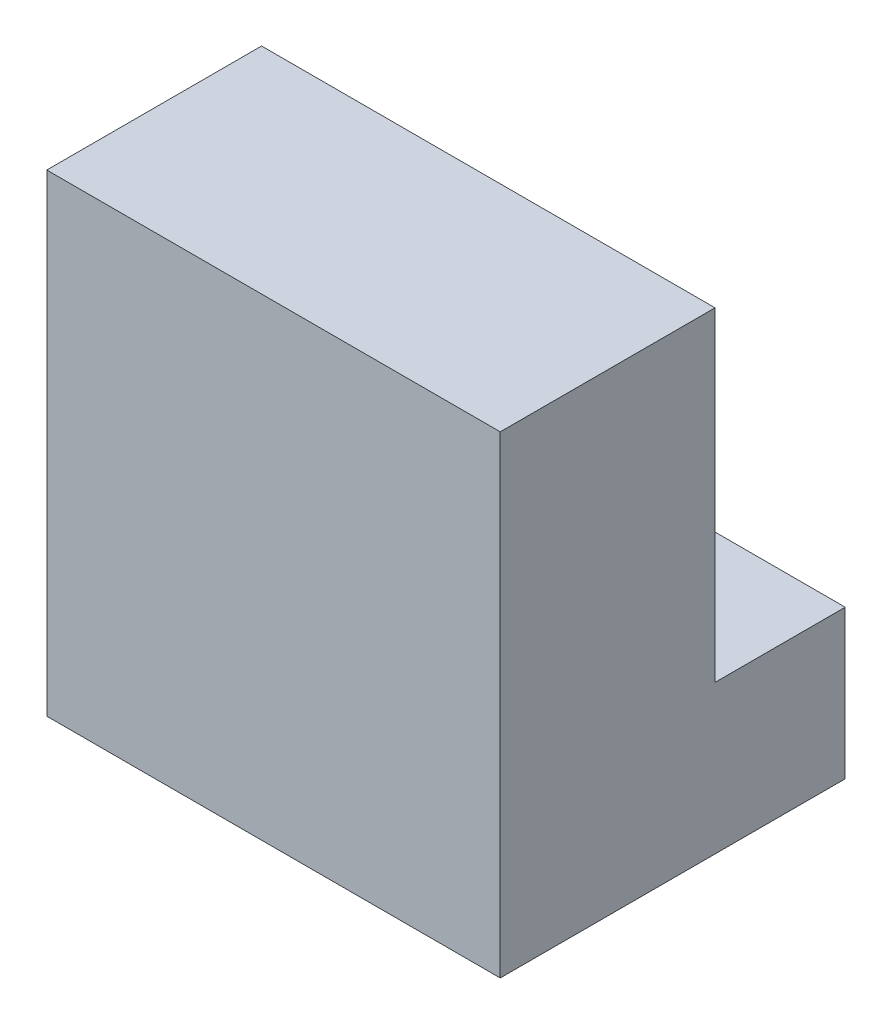
ISO-10303-21;
HEADER;
FILE_DESCRIPTION(('STEP AP214'),'2;1');
FILE_NAME('part.step','',(''),(''),'','','');
FILE_SCHEMA(('AUTOMOTIVE_DESIGN { 1 0 10303 214 1 1 1 1 }'));
ENDSEC;
DATA;
#1=APPLICATION_CONTEXT('core data for automotive mechanical design processes');
#2=APPLICATION_PROTOCOL_DEFINITION('international standard','automotive_design',2000,#1);
#3=PRODUCT_CONTEXT('',#1,'mechanical');
#4=PRODUCT('Part','Part','',(#3));
#5=PRODUCT_RELATED_PRODUCT_CATEGORY('part','',(#4));
#6=PRODUCT_DEFINITION_FORMATION('','',#4);
#7=PRODUCT_DEFINITION_CONTEXT('part definition',#1,'design');
#8=PRODUCT_DEFINITION('design','',#6,#7);
#9=PRODUCT_DEFINITION_SHAPE('','',#8);
#10=(LENGTH_UNIT() NAMED_UNIT(*) SI_UNIT(.MILLI.,.METRE.));
#11=(NAMED_UNIT(*) PLANE_ANGLE_UNIT() SI_UNIT($,.RADIAN.));
#12=(NAMED_UNIT(*) SI_UNIT($,.STERADIAN.) SOLID_ANGLE_UNIT());
#13=UNCERTAINTY_MEASURE_WITH_UNIT(LENGTH_MEASURE(1.E-05),#10,'distance_accuracy_value','');
#14=(GEOMETRIC_REPRESENTATION_CONTEXT(3) GLOBAL_UNCERTAINTY_ASSIGNED_CONTEXT((#13)) GLOBAL_UNIT_ASSIGNED_CONTEXT((#10,
#11,#12)) REPRESENTATION_CONTEXT('',''));
#15=CARTESIAN_POINT('',(0.,0.,0.));
#16=DIRECTION('',(0.,0.,1.));
#17=DIRECTION('',(1.,0.,0.));
#18=AXIS2_PLACEMENT_3D('',#15,#16,#17);
#19=CARTESIAN_POINT('',(0.,0.,0.));
#20=DIRECTION('',(0.,0.,1.));
#21=DIRECTION('',(1.,0.,0.));
#22=AXIS2_PLACEMENT_3D('',#19,#20,#21);
#23=PLANE('',#22);
#24=DIRECTION('',(1.,0.,0.));
#25=VECTOR('',#24,1.);
#26=CARTESIAN_POINT('',(20.9,-8.1,0.));
#27=LINE('',#26,#25);
#28=CARTESIAN_POINT('',(-20.9,-8.1,0.));
#29=VERTEX_POINT('',#28);
#30=CARTESIAN_POINT('',(20.9,-8.1,0.));
#31=VERTEX_POINT('',#30);
#32=EDGE_CURVE('E56',#29,#31,#27,.T.);
#33=ORIENTED_EDGE('',*,*,#32,.F.);
#34=DIRECTION('',(0.,-1.,0.));
#35=VECTOR('',#34,1.);
#36=CARTESIAN_POINT('',(-20.9,21.8,0.));
#37=LINE('',#36,#35);
#38=CARTESIAN_POINT('',(-20.9,21.8,0.));
#39=VERTEX_POINT('',#38);
#40=EDGE_CURVE('E136',#39,#29,#37,.T.);
#41=ORIENTED_EDGE('',*,*,#40,.F.);
#42=DIRECTION('',(-1.,0.,0.));
#43=VECTOR('',#42,1.);
#44=CARTESIAN_POINT('',(-20.9,21.8,0.));
#45=LINE('',#44,#43);
#46=CARTESIAN_POINT('',(20.9,21.8,0.));
#47=VERTEX_POINT('',#46);
#48=EDGE_CURVE('E80',#47,#39,#45,.T.);
#49=ORIENTED_EDGE('',*,*,#48,.F.);
#50=DIRECTION('',(0.,1.,0.));
#51=VECTOR('',#50,1.);
#52=CARTESIAN_POINT('',(20.9,21.8,0.));
#53=LINE('',#52,#51);
#54=EDGE_CURVE('E134',#31,#47,#53,.T.);
#55=ORIENTED_EDGE('',*,*,#54,.F.);
#56=EDGE_LOOP('',(#33,#41,#49,#55));
#57=FACE_BOUND('',#56,.T.);
#58=ADVANCED_FACE('F41',(#57),#23,.F.);
#59=CARTESIAN_POINT('',(20.9,21.8,19.8));
#60=DIRECTION('',(-1.,0.,0.));
#61=DIRECTION('',(0.,-1.,0.));
#62=AXIS2_PLACEMENT_3D('',#59,#60,#61);
#63=PLANE('',#62);
#64=DIRECTION('',(0.,0.,-1.));
#65=VECTOR('',#64,1.);
#66=CARTESIAN_POINT('',(20.9,-21.8,19.8));
#67=LINE('',#66,#65);
#68=CARTESIAN_POINT('',(20.9,-21.8,19.8));
#69=VERTEX_POINT('',#68);
#70=CARTESIAN_POINT('',(20.9,-21.8,-12.));
#71=VERTEX_POINT('',#70);
#72=EDGE_CURVE('E102',#69,#71,#67,.T.);
#73=ORIENTED_EDGE('',*,*,#72,.T.);
#74=DIRECTION('',(0.,-1.,0.));
#75=VECTOR('',#74,1.);
#76=CARTESIAN_POINT('',(20.9,-21.8,-12.));
#77=LINE('',#76,#75);
#78=CARTESIAN_POINT('',(20.9,-8.1,-12.));
#79=VERTEX_POINT('',#78);
#80=EDGE_CURVE('E106',#79,#71,#77,.T.);
#81=ORIENTED_EDGE('',*,*,#80,.F.);
#82=DIRECTION('',(0.,0.,1.));
#83=VECTOR('',#82,1.);
#84=CARTESIAN_POINT('',(20.9,-8.1,-12.));
#85=LINE('',#84,#83);
#86=EDGE_CURVE('E128',#79,#31,#85,.T.);
#87=ORIENTED_EDGE('',*,*,#86,.T.);
#88=ORIENTED_EDGE('',*,*,#54,.T.);
#89=DIRECTION('',(0.,0.,-1.));
#90=VECTOR('',#89,1.);
#91=CARTESIAN_POINT('',(20.9,21.8,19.8));
#92=LINE('',#91,#90);
#93=CARTESIAN_POINT('',(20.9,21.8,19.8));
#94=VERTEX_POINT('',#93);
#95=EDGE_CURVE('E11',#94,#47,#92,.T.);
#96=ORIENTED_EDGE('',*,*,#95,.F.);
#97=DIRECTION('',(0.,1.,0.));
#98=VECTOR('',#97,1.);
#99=CARTESIAN_POINT('',(20.9,21.8,19.8));
#100=LINE('',#99,#98);
#101=EDGE_CURVE('E108',#69,#94,#100,.T.);
#102=ORIENTED_EDGE('',*,*,#101,.F.);
#103=EDGE_LOOP('',(#73,#81,#87,#88,#96,#102));
#104=FACE_BOUND('',#103,.T.);
#105=ADVANCED_FACE('F43',(#104),#63,.F.);
#106=CARTESIAN_POINT('',(-20.9,21.8,19.8));
#107=DIRECTION('',(0.,-1.,0.));
#108=DIRECTION('',(0.,0.,-1.));
#109=AXIS2_PLACEMENT_3D('',#106,#107,#108);
#110=PLANE('',#109);
#111=ORIENTED_EDGE('',*,*,#48,.T.);
#112=DIRECTION('',(0.,0.,-1.));
#113=VECTOR('',#112,1.);
#114=CARTESIAN_POINT('',(-20.9,21.8,19.8));
#115=LINE('',#114,#113);
#116=CARTESIAN_POINT('',(-20.9,21.8,19.8));
#117=VERTEX_POINT('',#116);
#118=EDGE_CURVE('E49',#117,#39,#115,.T.);
#119=ORIENTED_EDGE('',*,*,#118,.F.);
#120=DIRECTION('',(-1.,0.,0.));
#121=VECTOR('',#120,1.);
#122=CARTESIAN_POINT('',(-20.9,21.8,19.8));
#123=LINE('',#122,#121);
#124=EDGE_CURVE('E85',#94,#117,#123,.T.);
#125=ORIENTED_EDGE('',*,*,#124,.F.);
#126=ORIENTED_EDGE('',*,*,#95,.T.);
#127=EDGE_LOOP('',(#111,#119,#125,#126));
#128=FACE_BOUND('',#127,.T.);
#129=ADVANCED_FACE('F148',(#128),#110,.F.);
#130=CARTESIAN_POINT('',(-20.9,21.8,19.8));
#131=DIRECTION('',(1.,0.,0.));
#132=DIRECTION('',(0.,1.,0.));
#133=AXIS2_PLACEMENT_3D('',#130,#131,#132);
#134=PLANE('',#133);
#135=ORIENTED_EDGE('',*,*,#40,.T.);
#136=DIRECTION('',(0.,0.,1.));
#137=VECTOR('',#136,1.);
#138=CARTESIAN_POINT('',(-20.9,-8.1,-12.));
#139=LINE('',#138,#137);
#140=CARTESIAN_POINT('',(-20.9,-8.1,-12.));
#141=VERTEX_POINT('',#140);
#142=EDGE_CURVE('E131',#141,#29,#139,.T.);
#143=ORIENTED_EDGE('',*,*,#142,.F.);
#144=DIRECTION('',(0.,1.,0.));
#145=VECTOR('',#144,1.);
#146=CARTESIAN_POINT('',(-20.9,-21.8,-12.));
#147=LINE('',#146,#145);
#148=CARTESIAN_POINT('',(-20.9,-21.8,-12.));
#149=VERTEX_POINT('',#148);
#150=EDGE_CURVE('E118',#149,#141,#147,.T.);
#151=ORIENTED_EDGE('',*,*,#150,.F.);
#152=DIRECTION('',(0.,0.,-1.));
#153=VECTOR('',#152,1.);
#154=CARTESIAN_POINT('',(-20.9,-21.8,19.8));
#155=LINE('',#154,#153);
#156=CARTESIAN_POINT('',(-20.9,-21.8,19.8));
#157=VERTEX_POINT('',#156);
#158=EDGE_CURVE('E110',#157,#149,#155,.T.);
#159=ORIENTED_EDGE('',*,*,#158,.F.);
#160=DIRECTION('',(0.,-1.,0.));
#161=VECTOR('',#160,1.);
#162=CARTESIAN_POINT('',(-20.9,21.8,19.8));
#163=LINE('',#162,#161);
#164=EDGE_CURVE('E138',#117,#157,#163,.T.);
#165=ORIENTED_EDGE('',*,*,#164,.F.);
#166=ORIENTED_EDGE('',*,*,#118,.T.);
#167=EDGE_LOOP('',(#135,#143,#151,#159,#165,#166));
#168=FACE_BOUND('',#167,.T.);
#169=ADVANCED_FACE('F146',(#168),#134,.F.);
#170=CARTESIAN_POINT('',(-20.9,-21.8,19.8));
#171=DIRECTION('',(0.,1.,0.));
#172=DIRECTION('',(0.,0.,1.));
#173=AXIS2_PLACEMENT_3D('',#170,#171,#172);
#174=PLANE('',#173);
#175=ORIENTED_EDGE('',*,*,#158,.T.);
#176=DIRECTION('',(-1.,0.,0.));
#177=VECTOR('',#176,1.);
#178=CARTESIAN_POINT('',(20.9,-21.8,-12.));
#179=LINE('',#178,#177);
#180=EDGE_CURVE('E113',#71,#149,#179,.T.);
#181=ORIENTED_EDGE('',*,*,#180,.F.);
#182=ORIENTED_EDGE('',*,*,#72,.F.);
#183=DIRECTION('',(1.,0.,0.));
#184=VECTOR('',#183,1.);
#185=CARTESIAN_POINT('',(-20.9,-21.8,19.8));
#186=LINE('',#185,#184);
#187=EDGE_CURVE('E65',#157,#69,#186,.T.);
#188=ORIENTED_EDGE('',*,*,#187,.F.);
#189=EDGE_LOOP('',(#175,#181,#182,#188));
#190=FACE_BOUND('',#189,.T.);
#191=ADVANCED_FACE('F114',(#190),#174,.F.);
#192=CARTESIAN_POINT('',(0.,0.,19.8));
#193=DIRECTION('',(0.,0.,1.));
#194=DIRECTION('',(1.,0.,0.));
#195=AXIS2_PLACEMENT_3D('',#192,#193,#194);
#196=PLANE('',#195);
#197=ORIENTED_EDGE('',*,*,#101,.T.);
#198=ORIENTED_EDGE('',*,*,#124,.T.);
#199=ORIENTED_EDGE('',*,*,#164,.T.);
#200=ORIENTED_EDGE('',*,*,#187,.T.);
#201=EDGE_LOOP('',(#197,#198,#199,#200));
#202=FACE_BOUND('',#201,.T.);
#203=ADVANCED_FACE('F152',(#202),#196,.T.);
#204=CARTESIAN_POINT('',(20.9,-8.1,-12.));
#205=DIRECTION('',(0.,-1.,0.));
#206=DIRECTION('',(0.,0.,-1.));
#207=AXIS2_PLACEMENT_3D('',#204,#205,#206);
#208=PLANE('',#207);
#209=ORIENTED_EDGE('',*,*,#32,.T.);
#210=ORIENTED_EDGE('',*,*,#86,.F.);
#211=DIRECTION('',(1.,0.,0.));
#212=VECTOR('',#211,1.);
#213=CARTESIAN_POINT('',(20.9,-8.1,-12.));
#214=LINE('',#213,#212);
#215=EDGE_CURVE('E122',#141,#79,#214,.T.);
#216=ORIENTED_EDGE('',*,*,#215,.F.);
#217=ORIENTED_EDGE('',*,*,#142,.T.);
#218=EDGE_LOOP('',(#209,#210,#216,#217));
#219=FACE_BOUND('',#218,.T.);
#220=ADVANCED_FACE('F150',(#219),#208,.F.);
#221=CARTESIAN_POINT('',(0.,0.,-12.));
#222=DIRECTION('',(0.,0.,1.));
#223=DIRECTION('',(1.,0.,0.));
#224=AXIS2_PLACEMENT_3D('',#221,#222,#223);
#225=PLANE('',#224);
#226=ORIENTED_EDGE('',*,*,#80,.T.);
#227=ORIENTED_EDGE('',*,*,#180,.T.);
#228=ORIENTED_EDGE('',*,*,#150,.T.);
#229=ORIENTED_EDGE('',*,*,#215,.T.);
#230=EDGE_LOOP('',(#226,#227,#228,#229));
#231=FACE_BOUND('',#230,.T.);
#232=ADVANCED_FACE('F120',(#231),#225,.F.);
#233=CLOSED_SHELL('',(#58,#105,#129,#169,#191,#203,#220,#232));
#234=MANIFOLD_SOLID_BREP('B2',#233);
#235=ADVANCED_BREP_SHAPE_REPRESENTATION('',(#18,#234),#14);
#236=SHAPE_DEFINITION_REPRESENTATION(#9,#235);
ENDSEC;
END-ISO-10303-21;
